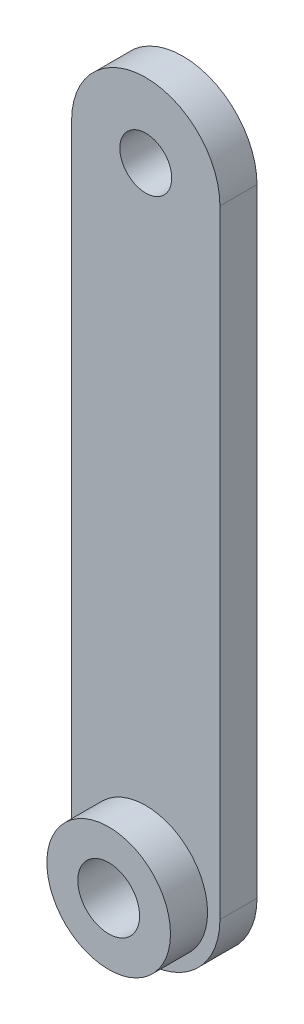
ISO-10303-21;
HEADER;
FILE_DESCRIPTION(('STEP AP214'),'2;1');
FILE_NAME('part.step','',(''),(''),'','','');
FILE_SCHEMA(('AUTOMOTIVE_DESIGN { 1 0 10303 214 1 1 1 1 }'));
ENDSEC;
DATA;
#1=APPLICATION_CONTEXT('core data for automotive mechanical design processes');
#2=APPLICATION_PROTOCOL_DEFINITION('international standard','automotive_design',2000,#1);
#3=PRODUCT_CONTEXT('',#1,'mechanical');
#4=PRODUCT('Part','Part','',(#3));
#5=PRODUCT_RELATED_PRODUCT_CATEGORY('part','',(#4));
#6=PRODUCT_DEFINITION_FORMATION('','',#4);
#7=PRODUCT_DEFINITION_CONTEXT('part definition',#1,'design');
#8=PRODUCT_DEFINITION('design','',#6,#7);
#9=PRODUCT_DEFINITION_SHAPE('','',#8);
#10=(LENGTH_UNIT() NAMED_UNIT(*) SI_UNIT(.MILLI.,.METRE.));
#11=(NAMED_UNIT(*) PLANE_ANGLE_UNIT() SI_UNIT($,.RADIAN.));
#12=(NAMED_UNIT(*) SI_UNIT($,.STERADIAN.) SOLID_ANGLE_UNIT());
#13=UNCERTAINTY_MEASURE_WITH_UNIT(LENGTH_MEASURE(1.E-05),#10,'distance_accuracy_value','');
#14=(GEOMETRIC_REPRESENTATION_CONTEXT(3) GLOBAL_UNCERTAINTY_ASSIGNED_CONTEXT((#13)) GLOBAL_UNIT_ASSIGNED_CONTEXT((#10,
#11,#12)) REPRESENTATION_CONTEXT('',''));
#15=CARTESIAN_POINT('',(0.,0.,0.));
#16=DIRECTION('',(0.,0.,1.));
#17=DIRECTION('',(1.,0.,0.));
#18=AXIS2_PLACEMENT_3D('',#15,#16,#17);
#19=CARTESIAN_POINT('',(-6.00000000000001,0.,1.5));
#20=DIRECTION('',(1.,0.,0.));
#21=DIRECTION('',(0.,1.,0.));
#22=AXIS2_PLACEMENT_3D('',#19,#20,#21);
#23=PLANE('',#22);
#24=DIRECTION('',(0.,-1.,0.));
#25=VECTOR('',#24,1.);
#26=CARTESIAN_POINT('',(-6.00000000000001,0.,-1.5));
#27=LINE('',#26,#25);
#28=CARTESIAN_POINT('',(-6.,50.,-1.5));
#29=VERTEX_POINT('',#28);
#30=CARTESIAN_POINT('',(-6.00000000000001,0.,-1.5));
#31=VERTEX_POINT('',#30);
#32=EDGE_CURVE('E114',#29,#31,#27,.T.);
#33=ORIENTED_EDGE('',*,*,#32,.T.);
#34=DIRECTION('',(0.,0.,-1.));
#35=VECTOR('',#34,1.);
#36=CARTESIAN_POINT('',(-6.00000000000001,0.,1.5));
#37=LINE('',#36,#35);
#38=CARTESIAN_POINT('',(-6.00000000000001,0.,1.5));
#39=VERTEX_POINT('',#38);
#40=EDGE_CURVE('E11',#39,#31,#37,.T.);
#41=ORIENTED_EDGE('',*,*,#40,.F.);
#42=DIRECTION('',(0.,-1.,0.));
#43=VECTOR('',#42,1.);
#44=CARTESIAN_POINT('',(-6.00000000000001,0.,1.5));
#45=LINE('',#44,#43);
#46=CARTESIAN_POINT('',(-6.,50.,1.5));
#47=VERTEX_POINT('',#46);
#48=EDGE_CURVE('E95',#47,#39,#45,.T.);
#49=ORIENTED_EDGE('',*,*,#48,.F.);
#50=DIRECTION('',(0.,0.,-1.));
#51=VECTOR('',#50,1.);
#52=CARTESIAN_POINT('',(-6.,50.,1.5));
#53=LINE('',#52,#51);
#54=EDGE_CURVE('E110',#47,#29,#53,.T.);
#55=ORIENTED_EDGE('',*,*,#54,.T.);
#56=EDGE_LOOP('',(#33,#41,#49,#55));
#57=FACE_BOUND('',#56,.T.);
#58=ADVANCED_FACE('F47',(#57),#23,.F.);
#59=CARTESIAN_POINT('',(0.,0.,1.5));
#60=DIRECTION('',(0.,0.,-1.));
#61=DIRECTION('',(-1.,0.,0.));
#62=AXIS2_PLACEMENT_3D('',#59,#60,#61);
#63=CYLINDRICAL_SURFACE('',#62,6.00000000000001);
#64=CARTESIAN_POINT('',(0.,0.,-1.5));
#65=DIRECTION('',(0.,0.,1.));
#66=DIRECTION('',(1.,0.,0.));
#67=AXIS2_PLACEMENT_3D('',#64,#65,#66);
#68=CIRCLE('',#67,6.00000000000001);
#69=CARTESIAN_POINT('',(6.00000000000001,0.,-1.5));
#70=VERTEX_POINT('',#69);
#71=EDGE_CURVE('E101',#31,#70,#68,.T.);
#72=ORIENTED_EDGE('',*,*,#71,.T.);
#73=DIRECTION('',(0.,0.,-1.));
#74=VECTOR('',#73,1.);
#75=CARTESIAN_POINT('',(6.00000000000001,0.,1.5));
#76=LINE('',#75,#74);
#77=CARTESIAN_POINT('',(6.00000000000001,0.,1.5));
#78=VERTEX_POINT('',#77);
#79=EDGE_CURVE('E56',#78,#70,#76,.T.);
#80=ORIENTED_EDGE('',*,*,#79,.F.);
#81=CARTESIAN_POINT('',(0.,0.,1.5));
#82=DIRECTION('',(0.,0.,1.));
#83=DIRECTION('',(1.,0.,0.));
#84=AXIS2_PLACEMENT_3D('',#81,#82,#83);
#85=CIRCLE('',#84,6.00000000000001);
#86=EDGE_CURVE('E90',#39,#78,#85,.T.);
#87=ORIENTED_EDGE('',*,*,#86,.F.);
#88=ORIENTED_EDGE('',*,*,#40,.T.);
#89=EDGE_LOOP('',(#72,#80,#87,#88));
#90=FACE_BOUND('',#89,.T.);
#91=ADVANCED_FACE('F100',(#90),#63,.T.);
#92=CARTESIAN_POINT('',(6.00000000000001,0.,1.5));
#93=DIRECTION('',(1.,0.,0.));
#94=DIRECTION('',(0.,1.,0.));
#95=AXIS2_PLACEMENT_3D('',#92,#93,#94);
#96=PLANE('',#95);
#97=DIRECTION('',(0.,-1.,0.));
#98=VECTOR('',#97,1.);
#99=CARTESIAN_POINT('',(6.00000000000001,0.,-1.5));
#100=LINE('',#99,#98);
#101=CARTESIAN_POINT('',(6.,50.,-1.5));
#102=VERTEX_POINT('',#101);
#103=EDGE_CURVE('E121',#102,#70,#100,.T.);
#104=ORIENTED_EDGE('',*,*,#103,.F.);
#105=DIRECTION('',(0.,0.,-1.));
#106=VECTOR('',#105,1.);
#107=CARTESIAN_POINT('',(6.,50.,1.5));
#108=LINE('',#107,#106);
#109=CARTESIAN_POINT('',(6.,50.,1.5));
#110=VERTEX_POINT('',#109);
#111=EDGE_CURVE('E80',#110,#102,#108,.T.);
#112=ORIENTED_EDGE('',*,*,#111,.F.);
#113=DIRECTION('',(0.,-1.,0.));
#114=VECTOR('',#113,1.);
#115=CARTESIAN_POINT('',(6.00000000000001,0.,1.5));
#116=LINE('',#115,#114);
#117=EDGE_CURVE('E93',#110,#78,#116,.T.);
#118=ORIENTED_EDGE('',*,*,#117,.T.);
#119=ORIENTED_EDGE('',*,*,#79,.T.);
#120=EDGE_LOOP('',(#104,#112,#118,#119));
#121=FACE_BOUND('',#120,.T.);
#122=ADVANCED_FACE('F106',(#121),#96,.T.);
#123=CARTESIAN_POINT('',(0.,50.,1.5));
#124=DIRECTION('',(0.,0.,-1.));
#125=DIRECTION('',(-1.,0.,0.));
#126=AXIS2_PLACEMENT_3D('',#123,#124,#125);
#127=CYLINDRICAL_SURFACE('',#126,6.);
#128=CARTESIAN_POINT('',(0.,50.,-1.5));
#129=DIRECTION('',(0.,0.,1.));
#130=DIRECTION('',(1.,0.,0.));
#131=AXIS2_PLACEMENT_3D('',#128,#129,#130);
#132=CIRCLE('',#131,6.);
#133=EDGE_CURVE('E83',#102,#29,#132,.T.);
#134=ORIENTED_EDGE('',*,*,#133,.T.);
#135=ORIENTED_EDGE('',*,*,#54,.F.);
#136=CARTESIAN_POINT('',(0.,50.,1.5));
#137=DIRECTION('',(0.,0.,1.));
#138=DIRECTION('',(1.,0.,0.));
#139=AXIS2_PLACEMENT_3D('',#136,#137,#138);
#140=CIRCLE('',#139,6.);
#141=EDGE_CURVE('E64',#110,#47,#140,.T.);
#142=ORIENTED_EDGE('',*,*,#141,.F.);
#143=ORIENTED_EDGE('',*,*,#111,.T.);
#144=EDGE_LOOP('',(#134,#135,#142,#143));
#145=FACE_BOUND('',#144,.T.);
#146=ADVANCED_FACE('F144',(#145),#127,.T.);
#147=CARTESIAN_POINT('',(0.,0.,1.5));
#148=DIRECTION('',(0.,0.,1.));
#149=DIRECTION('',(1.,0.,0.));
#150=AXIS2_PLACEMENT_3D('',#147,#148,#149);
#151=PLANE('',#150);
#152=CARTESIAN_POINT('',(0.,50.,1.5));
#153=DIRECTION('',(0.,0.,1.));
#154=DIRECTION('',(1.,0.,0.));
#155=AXIS2_PLACEMENT_3D('',#152,#153,#154);
#156=CIRCLE('',#155,2.1);
#157=CARTESIAN_POINT('',(2.1,50.,1.5));
#158=VERTEX_POINT('',#157);
#159=EDGE_CURVE('E272',#158,#158,#156,.T.);
#160=ORIENTED_EDGE('',*,*,#159,.F.);
#161=EDGE_LOOP('',(#160));
#162=FACE_BOUND('',#161,.T.);
#163=CARTESIAN_POINT('',(0.,0.,1.5));
#164=DIRECTION('',(0.,0.,1.));
#165=DIRECTION('',(1.,0.,0.));
#166=AXIS2_PLACEMENT_3D('',#163,#164,#165);
#167=CIRCLE('',#166,5.);
#168=CARTESIAN_POINT('',(5.,0.,1.5));
#169=VERTEX_POINT('',#168);
#170=EDGE_CURVE('E252',#169,#169,#167,.T.);
#171=ORIENTED_EDGE('',*,*,#170,.F.);
#172=EDGE_LOOP('',(#171));
#173=FACE_BOUND('',#172,.T.);
#174=ORIENTED_EDGE('',*,*,#48,.T.);
#175=ORIENTED_EDGE('',*,*,#86,.T.);
#176=ORIENTED_EDGE('',*,*,#117,.F.);
#177=ORIENTED_EDGE('',*,*,#141,.T.);
#178=EDGE_LOOP('',(#174,#175,#176,#177));
#179=FACE_BOUND('',#178,.T.);
#180=ADVANCED_FACE('F91',(#162,#173,#179),#151,.T.);
#181=CARTESIAN_POINT('',(0.,0.,-1.5));
#182=DIRECTION('',(0.,0.,1.));
#183=DIRECTION('',(1.,0.,0.));
#184=AXIS2_PLACEMENT_3D('',#181,#182,#183);
#185=PLANE('',#184);
#186=CARTESIAN_POINT('',(0.,50.,-1.5));
#187=DIRECTION('',(0.,0.,1.));
#188=DIRECTION('',(1.,0.,0.));
#189=AXIS2_PLACEMENT_3D('',#186,#187,#188);
#190=CIRCLE('',#189,2.1);
#191=CARTESIAN_POINT('',(2.1,50.,-1.5));
#192=VERTEX_POINT('',#191);
#193=EDGE_CURVE('E268',#192,#192,#190,.F.);
#194=ORIENTED_EDGE('',*,*,#193,.F.);
#195=EDGE_LOOP('',(#194));
#196=FACE_BOUND('',#195,.T.);
#197=CARTESIAN_POINT('',(0.,0.,-1.5));
#198=DIRECTION('',(0.,0.,1.));
#199=DIRECTION('',(1.,0.,0.));
#200=AXIS2_PLACEMENT_3D('',#197,#198,#199);
#201=CIRCLE('',#200,2.5);
#202=CARTESIAN_POINT('',(2.5,0.,-1.5));
#203=VERTEX_POINT('',#202);
#204=EDGE_CURVE('E261',#203,#203,#201,.F.);
#205=ORIENTED_EDGE('',*,*,#204,.F.);
#206=EDGE_LOOP('',(#205));
#207=FACE_BOUND('',#206,.T.);
#208=ORIENTED_EDGE('',*,*,#32,.F.);
#209=ORIENTED_EDGE('',*,*,#133,.F.);
#210=ORIENTED_EDGE('',*,*,#103,.T.);
#211=ORIENTED_EDGE('',*,*,#71,.F.);
#212=EDGE_LOOP('',(#208,#209,#210,#211));
#213=FACE_BOUND('',#212,.T.);
#214=ADVANCED_FACE('F132',(#196,#207,#213),#185,.F.);
#215=CARTESIAN_POINT('',(0.,0.,4.5));
#216=DIRECTION('',(0.,0.,1.));
#217=DIRECTION('',(1.,0.,0.));
#218=AXIS2_PLACEMENT_3D('',#215,#216,#217);
#219=PLANE('',#218);
#220=CARTESIAN_POINT('',(0.,0.,4.5));
#221=DIRECTION('',(0.,0.,1.));
#222=DIRECTION('',(1.,0.,0.));
#223=AXIS2_PLACEMENT_3D('',#220,#221,#222);
#224=CIRCLE('',#223,5.);
#225=CARTESIAN_POINT('',(5.,0.,4.5));
#226=VERTEX_POINT('',#225);
#227=EDGE_CURVE('E118',#226,#226,#224,.T.);
#228=ORIENTED_EDGE('',*,*,#227,.T.);
#229=EDGE_LOOP('',(#228));
#230=FACE_BOUND('',#229,.T.);
#231=CARTESIAN_POINT('',(0.,0.,4.5));
#232=DIRECTION('',(0.,0.,1.));
#233=DIRECTION('',(1.,0.,0.));
#234=AXIS2_PLACEMENT_3D('',#231,#232,#233);
#235=CIRCLE('',#234,2.5);
#236=CARTESIAN_POINT('',(2.5,0.,4.5));
#237=VERTEX_POINT('',#236);
#238=EDGE_CURVE('E255',#237,#237,#235,.T.);
#239=ORIENTED_EDGE('',*,*,#238,.F.);
#240=EDGE_LOOP('',(#239));
#241=FACE_BOUND('',#240,.T.);
#242=ADVANCED_FACE('F134',(#230,#241),#219,.T.);
#243=CARTESIAN_POINT('',(0.,0.,4.5));
#244=DIRECTION('',(0.,0.,-1.));
#245=DIRECTION('',(-1.,0.,0.));
#246=AXIS2_PLACEMENT_3D('',#243,#244,#245);
#247=CYLINDRICAL_SURFACE('',#246,5.);
#248=ORIENTED_EDGE('',*,*,#227,.F.);
#249=EDGE_LOOP('',(#248));
#250=FACE_BOUND('',#249,.T.);
#251=ORIENTED_EDGE('',*,*,#170,.T.);
#252=EDGE_LOOP('',(#251));
#253=FACE_BOUND('',#252,.T.);
#254=ADVANCED_FACE('F141',(#250,#253),#247,.T.);
#255=CARTESIAN_POINT('',(0.,0.,4.5));
#256=DIRECTION('',(0.,0.,-1.));
#257=DIRECTION('',(-1.,0.,0.));
#258=AXIS2_PLACEMENT_3D('',#255,#256,#257);
#259=CYLINDRICAL_SURFACE('',#258,2.5);
#260=ORIENTED_EDGE('',*,*,#238,.T.);
#261=EDGE_LOOP('',(#260));
#262=FACE_BOUND('',#261,.T.);
#263=ORIENTED_EDGE('',*,*,#204,.T.);
#264=EDGE_LOOP('',(#263));
#265=FACE_BOUND('',#264,.T.);
#266=ADVANCED_FACE('F175',(#262,#265),#259,.F.);
#267=CARTESIAN_POINT('',(0.,50.,-1.501));
#268=DIRECTION('',(0.,0.,1.));
#269=DIRECTION('',(1.,0.,0.));
#270=AXIS2_PLACEMENT_3D('',#267,#268,#269);
#271=CYLINDRICAL_SURFACE('',#270,2.1);
#272=CARTESIAN_POINT('',(2.1,50.,1.5));
#273=CARTESIAN_POINT('',(2.1,50.,1.46875));
#274=CARTESIAN_POINT('',(2.1,50.,1.4375));
#275=CARTESIAN_POINT('',(2.1,50.,1.375));
#276=CARTESIAN_POINT('',(2.1,50.,1.34375));
#277=CARTESIAN_POINT('',(2.1,50.,1.28125));
#278=CARTESIAN_POINT('',(2.1,50.,1.25));
#279=CARTESIAN_POINT('',(2.1,50.,1.1875));
#280=CARTESIAN_POINT('',(2.1,50.,1.15625));
#281=CARTESIAN_POINT('',(2.1,50.,1.09375));
#282=CARTESIAN_POINT('',(2.1,50.,1.0625));
#283=CARTESIAN_POINT('',(2.1,50.,1.));
#284=CARTESIAN_POINT('',(2.1,50.,0.96875));
#285=CARTESIAN_POINT('',(2.1,50.,0.90625));
#286=CARTESIAN_POINT('',(2.1,50.,0.874999999999999));
#287=CARTESIAN_POINT('',(2.1,50.,0.8125));
#288=CARTESIAN_POINT('',(2.1,50.,0.78125));
#289=CARTESIAN_POINT('',(2.1,50.,0.71875));
#290=CARTESIAN_POINT('',(2.1,50.,0.6875));
#291=CARTESIAN_POINT('',(2.1,50.,0.625));
#292=CARTESIAN_POINT('',(2.1,50.,0.59375));
#293=CARTESIAN_POINT('',(2.1,50.,0.53125));
#294=CARTESIAN_POINT('',(2.1,50.,0.5));
#295=CARTESIAN_POINT('',(2.1,50.,0.4375));
#296=CARTESIAN_POINT('',(2.1,50.,0.40625));
#297=CARTESIAN_POINT('',(2.1,50.,0.34375));
#298=CARTESIAN_POINT('',(2.1,50.,0.3125));
#299=CARTESIAN_POINT('',(2.1,50.,0.25));
#300=CARTESIAN_POINT('',(2.1,50.,0.21875));
#301=CARTESIAN_POINT('',(2.1,50.,0.15625));
#302=CARTESIAN_POINT('',(2.1,50.,0.125));
#303=CARTESIAN_POINT('',(2.1,50.,0.0624999999999998));
#304=CARTESIAN_POINT('',(2.1,50.,0.0312499999999998));
#305=CARTESIAN_POINT('',(2.1,50.,-0.0312500000000002));
#306=CARTESIAN_POINT('',(2.1,50.,-0.0625000000000003));
#307=CARTESIAN_POINT('',(2.1,50.,-0.125));
#308=CARTESIAN_POINT('',(2.1,50.,-0.15625));
#309=CARTESIAN_POINT('',(2.1,50.,-0.21875));
#310=CARTESIAN_POINT('',(2.1,50.,-0.25));
#311=CARTESIAN_POINT('',(2.1,50.,-0.3125));
#312=CARTESIAN_POINT('',(2.1,50.,-0.34375));
#313=CARTESIAN_POINT('',(2.1,50.,-0.40625));
#314=CARTESIAN_POINT('',(2.1,50.,-0.4375));
#315=CARTESIAN_POINT('',(2.1,50.,-0.5));
#316=CARTESIAN_POINT('',(2.1,50.,-0.53125));
#317=CARTESIAN_POINT('',(2.1,50.,-0.59375));
#318=CARTESIAN_POINT('',(2.1,50.,-0.625));
#319=CARTESIAN_POINT('',(2.1,50.,-0.6875));
#320=CARTESIAN_POINT('',(2.1,50.,-0.71875));
#321=CARTESIAN_POINT('',(2.1,50.,-0.78125));
#322=CARTESIAN_POINT('',(2.1,50.,-0.8125));
#323=CARTESIAN_POINT('',(2.1,50.,-0.875));
#324=CARTESIAN_POINT('',(2.1,50.,-0.90625));
#325=CARTESIAN_POINT('',(2.1,50.,-0.96875));
#326=CARTESIAN_POINT('',(2.1,50.,-1.));
#327=CARTESIAN_POINT('',(2.1,50.,-1.0625));
#328=CARTESIAN_POINT('',(2.1,50.,-1.09375));
#329=CARTESIAN_POINT('',(2.1,50.,-1.15625));
#330=CARTESIAN_POINT('',(2.1,50.,-1.1875));
#331=CARTESIAN_POINT('',(2.1,50.,-1.25));
#332=CARTESIAN_POINT('',(2.1,50.,-1.28125));
#333=CARTESIAN_POINT('',(2.1,50.,-1.34375));
#334=CARTESIAN_POINT('',(2.1,50.,-1.375));
#335=CARTESIAN_POINT('',(2.1,50.,-1.4375));
#336=CARTESIAN_POINT('',(2.1,50.,-1.46875));
#337=CARTESIAN_POINT('',(2.1,50.,-1.5));
#338=B_SPLINE_CURVE_WITH_KNOTS('',3,(#272,#273,#274,#275,#276,#277,#278,#279,#280,#281,#282,
#283,#284,#285,#286,#287,#288,#289,#290,#291,#292,#293,#294,#295,#296,#297,#298,#299,#300,#301,
#302,#303,#304,#305,#306,#307,#308,#309,#310,#311,#312,#313,#314,#315,#316,#317,#318,#319,#320,
#321,#322,#323,#324,#325,#326,#327,#328,#329,#330,#331,#332,#333,#334,#335,#336,#337),
.UNSPECIFIED.,.F.,.F.,(4,2,2,2,2,2,2,2,2,2,2,2,2,2,2,2,2,2,2,2,2,2,2,2,2,2,2,2,2,2,2,2,4),(0.,
0.0937500000000001,0.1875,0.28125,0.375,0.46875,0.5625,0.65625,0.75,0.84375,0.9375,1.03125,
1.125,1.21875,1.3125,1.40625,1.5,1.59375,1.6875,1.78125,1.875,1.96875,2.0625,2.15625,2.25,
2.34375,2.4375,2.53125,2.625,2.71875,2.8125,2.90625,3.),.UNSPECIFIED.);
#339=EDGE_CURVE('BSEAM186',#158,#192,#338,.T.);
#340=ORIENTED_EDGE('',*,*,#159,.T.);
#341=ORIENTED_EDGE('',*,*,#193,.T.);
#342=ORIENTED_EDGE('',*,*,#339,.T.);
#343=ORIENTED_EDGE('',*,*,#339,.F.);
#344=EDGE_LOOP('',(#340,#342,#341,#343));
#345=FACE_BOUND('',#344,.T.);
#346=ADVANCED_FACE('F186',(#345),#271,.F.);
#347=CLOSED_SHELL('',(#58,#91,#122,#146,#180,#214,#242,#254,#266,#346));
#348=MANIFOLD_SOLID_BREP('B2',#347);
#349=ADVANCED_BREP_SHAPE_REPRESENTATION('',(#18,#348),#14);
#350=SHAPE_DEFINITION_REPRESENTATION(#9,#349);
ENDSEC;
END-ISO-10303-21;
